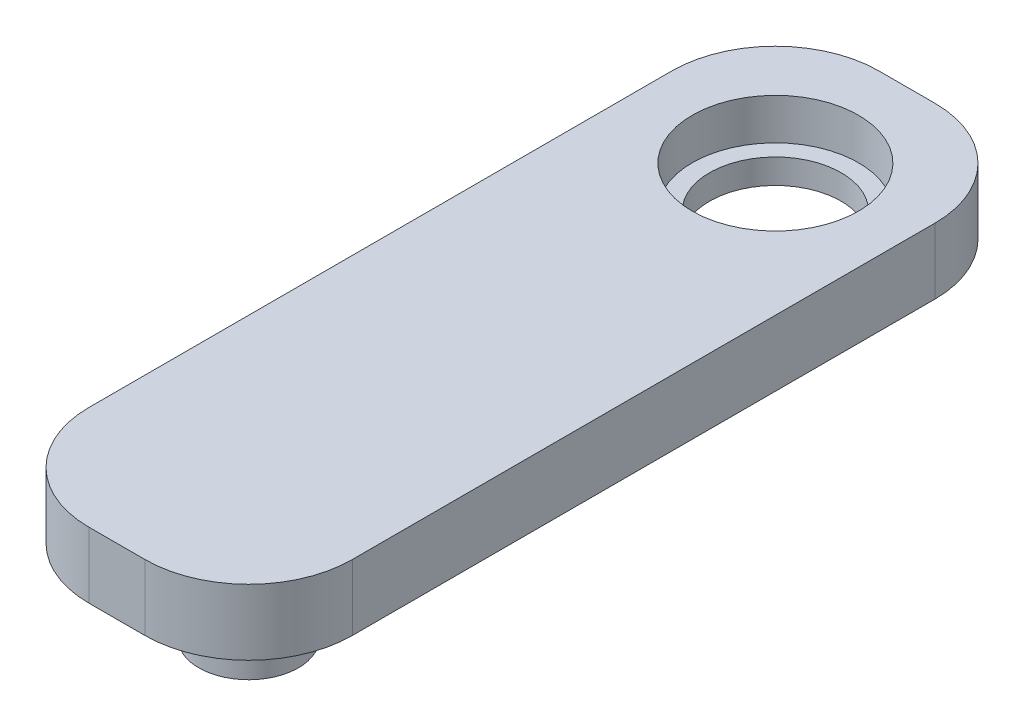
ISO-10303-21;
HEADER;
FILE_DESCRIPTION(('STEP AP214'),'2;1');
FILE_NAME('part.step','',(''),(''),'','','');
FILE_SCHEMA(('AUTOMOTIVE_DESIGN { 1 0 10303 214 1 1 1 1 }'));
ENDSEC;
DATA;
#1=APPLICATION_CONTEXT('core data for automotive mechanical design processes');
#2=APPLICATION_PROTOCOL_DEFINITION('international standard','automotive_design',2000,#1);
#3=PRODUCT_CONTEXT('',#1,'mechanical');
#4=PRODUCT('Part','Part','',(#3));
#5=PRODUCT_RELATED_PRODUCT_CATEGORY('part','',(#4));
#6=PRODUCT_DEFINITION_FORMATION('','',#4);
#7=PRODUCT_DEFINITION_CONTEXT('part definition',#1,'design');
#8=PRODUCT_DEFINITION('design','',#6,#7);
#9=PRODUCT_DEFINITION_SHAPE('','',#8);
#10=(LENGTH_UNIT() NAMED_UNIT(*) SI_UNIT(.MILLI.,.METRE.));
#11=(NAMED_UNIT(*) PLANE_ANGLE_UNIT() SI_UNIT($,.RADIAN.));
#12=(NAMED_UNIT(*) SI_UNIT($,.STERADIAN.) SOLID_ANGLE_UNIT());
#13=UNCERTAINTY_MEASURE_WITH_UNIT(LENGTH_MEASURE(1.E-05),#10,'distance_accuracy_value','');
#14=(GEOMETRIC_REPRESENTATION_CONTEXT(3) GLOBAL_UNCERTAINTY_ASSIGNED_CONTEXT((#13)) GLOBAL_UNIT_ASSIGNED_CONTEXT((#10,
#11,#12)) REPRESENTATION_CONTEXT('',''));
#15=CARTESIAN_POINT('',(0.,0.,0.));
#16=DIRECTION('',(0.,0.,1.));
#17=DIRECTION('',(1.,0.,0.));
#18=AXIS2_PLACEMENT_3D('',#15,#16,#17);
#19=CARTESIAN_POINT('',(0.,6.35,0.));
#20=DIRECTION('',(1.,0.,0.));
#21=DIRECTION('',(0.,0.,-1.));
#22=AXIS2_PLACEMENT_3D('',#19,#20,#21);
#23=PLANE('',#22);
#24=DIRECTION('',(0.,0.,1.));
#25=VECTOR('',#24,1.);
#26=CARTESIAN_POINT('',(0.,0.,0.));
#27=LINE('',#26,#25);
#28=CARTESIAN_POINT('',(0.,0.,-66.2));
#29=VERTEX_POINT('',#28);
#30=CARTESIAN_POINT('',(0.,0.,-9.99999999999999));
#31=VERTEX_POINT('',#30);
#32=EDGE_CURVE('E127',#29,#31,#27,.T.);
#33=ORIENTED_EDGE('',*,*,#32,.T.);
#34=DIRECTION('',(0.,-1.,0.));
#35=VECTOR('',#34,1.);
#36=CARTESIAN_POINT('',(0.,6.35,-10.));
#37=LINE('',#36,#35);
#38=CARTESIAN_POINT('',(0.,6.35,-9.99999999999999));
#39=VERTEX_POINT('',#38);
#40=EDGE_CURVE('E105',#31,#39,#37,.F.);
#41=ORIENTED_EDGE('',*,*,#40,.T.);
#42=DIRECTION('',(0.,0.,1.));
#43=VECTOR('',#42,1.);
#44=CARTESIAN_POINT('',(0.,6.35,0.));
#45=LINE('',#44,#43);
#46=CARTESIAN_POINT('',(0.,6.35,-66.2));
#47=VERTEX_POINT('',#46);
#48=EDGE_CURVE('E137',#47,#39,#45,.T.);
#49=ORIENTED_EDGE('',*,*,#48,.F.);
#50=DIRECTION('',(0.,-1.,0.));
#51=VECTOR('',#50,1.);
#52=CARTESIAN_POINT('',(0.,6.35,-66.2));
#53=LINE('',#52,#51);
#54=EDGE_CURVE('E110',#47,#29,#53,.T.);
#55=ORIENTED_EDGE('',*,*,#54,.T.);
#56=EDGE_LOOP('',(#33,#41,#49,#55));
#57=FACE_BOUND('',#56,.T.);
#58=ADVANCED_FACE('F35',(#57),#23,.F.);
#59=CARTESIAN_POINT('',(0.,6.35,0.));
#60=DIRECTION('',(0.,0.,-1.));
#61=DIRECTION('',(-1.,0.,0.));
#62=AXIS2_PLACEMENT_3D('',#59,#60,#61);
#63=PLANE('',#62);
#64=DIRECTION('',(1.,0.,0.));
#65=VECTOR('',#64,1.);
#66=CARTESIAN_POINT('',(0.,6.35,0.));
#67=LINE('',#66,#65);
#68=CARTESIAN_POINT('',(10.,6.35,0.));
#69=VERTEX_POINT('',#68);
#70=CARTESIAN_POINT('',(15.4,6.35,0.));
#71=VERTEX_POINT('',#70);
#72=EDGE_CURVE('E120',#69,#71,#67,.T.);
#73=ORIENTED_EDGE('',*,*,#72,.F.);
#74=DIRECTION('',(0.,-1.,0.));
#75=VECTOR('',#74,1.);
#76=CARTESIAN_POINT('',(10.,6.35,0.));
#77=LINE('',#76,#75);
#78=CARTESIAN_POINT('',(10.,0.,0.));
#79=VERTEX_POINT('',#78);
#80=EDGE_CURVE('E104',#69,#79,#77,.T.);
#81=ORIENTED_EDGE('',*,*,#80,.T.);
#82=DIRECTION('',(1.,0.,0.));
#83=VECTOR('',#82,1.);
#84=CARTESIAN_POINT('',(0.,0.,0.));
#85=LINE('',#84,#83);
#86=CARTESIAN_POINT('',(15.4,0.,0.));
#87=VERTEX_POINT('',#86);
#88=EDGE_CURVE('E117',#79,#87,#85,.T.);
#89=ORIENTED_EDGE('',*,*,#88,.T.);
#90=DIRECTION('',(0.,-1.,0.));
#91=VECTOR('',#90,1.);
#92=CARTESIAN_POINT('',(15.4,6.35,0.));
#93=LINE('',#92,#91);
#94=EDGE_CURVE('E122',#87,#71,#93,.F.);
#95=ORIENTED_EDGE('',*,*,#94,.T.);
#96=EDGE_LOOP('',(#73,#81,#89,#95));
#97=FACE_BOUND('',#96,.T.);
#98=ADVANCED_FACE('F116',(#97),#63,.F.);
#99=CARTESIAN_POINT('',(25.4,6.35,0.));
#100=DIRECTION('',(-1.,0.,0.));
#101=DIRECTION('',(0.,0.,1.));
#102=AXIS2_PLACEMENT_3D('',#99,#100,#101);
#103=PLANE('',#102);
#104=DIRECTION('',(0.,0.,-1.));
#105=VECTOR('',#104,1.);
#106=CARTESIAN_POINT('',(25.4,6.35,0.));
#107=LINE('',#106,#105);
#108=CARTESIAN_POINT('',(25.4,6.35,-10.));
#109=VERTEX_POINT('',#108);
#110=CARTESIAN_POINT('',(25.4,6.35,-66.2));
#111=VERTEX_POINT('',#110);
#112=EDGE_CURVE('E172',#109,#111,#107,.T.);
#113=ORIENTED_EDGE('',*,*,#112,.F.);
#114=DIRECTION('',(0.,-1.,0.));
#115=VECTOR('',#114,1.);
#116=CARTESIAN_POINT('',(25.4,6.35,-10.));
#117=LINE('',#116,#115);
#118=CARTESIAN_POINT('',(25.4,0.,-10.));
#119=VERTEX_POINT('',#118);
#120=EDGE_CURVE('E156',#109,#119,#117,.T.);
#121=ORIENTED_EDGE('',*,*,#120,.T.);
#122=DIRECTION('',(0.,0.,-1.));
#123=VECTOR('',#122,1.);
#124=CARTESIAN_POINT('',(25.4,0.,0.));
#125=LINE('',#124,#123);
#126=CARTESIAN_POINT('',(25.4,0.,-66.2));
#127=VERTEX_POINT('',#126);
#128=EDGE_CURVE('E126',#119,#127,#125,.T.);
#129=ORIENTED_EDGE('',*,*,#128,.T.);
#130=DIRECTION('',(0.,-1.,0.));
#131=VECTOR('',#130,1.);
#132=CARTESIAN_POINT('',(25.4,6.35,-66.2));
#133=LINE('',#132,#131);
#134=EDGE_CURVE('E154',#127,#111,#133,.F.);
#135=ORIENTED_EDGE('',*,*,#134,.T.);
#136=EDGE_LOOP('',(#113,#121,#129,#135));
#137=FACE_BOUND('',#136,.T.);
#138=ADVANCED_FACE('F213',(#137),#103,.F.);
#139=CARTESIAN_POINT('',(0.,6.35,-76.2));
#140=DIRECTION('',(0.,0.,1.));
#141=DIRECTION('',(1.,0.,0.));
#142=AXIS2_PLACEMENT_3D('',#139,#140,#141);
#143=PLANE('',#142);
#144=DIRECTION('',(-1.,0.,0.));
#145=VECTOR('',#144,1.);
#146=CARTESIAN_POINT('',(0.,0.,-76.2));
#147=LINE('',#146,#145);
#148=CARTESIAN_POINT('',(15.4,0.,-76.2));
#149=VERTEX_POINT('',#148);
#150=CARTESIAN_POINT('',(9.99999999999998,0.,-76.2));
#151=VERTEX_POINT('',#150);
#152=EDGE_CURVE('E130',#149,#151,#147,.T.);
#153=ORIENTED_EDGE('',*,*,#152,.T.);
#154=DIRECTION('',(0.,-1.,0.));
#155=VECTOR('',#154,1.);
#156=CARTESIAN_POINT('',(9.99999999999998,6.35,-76.2));
#157=LINE('',#156,#155);
#158=CARTESIAN_POINT('',(9.99999999999998,6.35,-76.2));
#159=VERTEX_POINT('',#158);
#160=EDGE_CURVE('E11',#151,#159,#157,.F.);
#161=ORIENTED_EDGE('',*,*,#160,.T.);
#162=DIRECTION('',(-1.,0.,0.));
#163=VECTOR('',#162,1.);
#164=CARTESIAN_POINT('',(0.,6.35,-76.2));
#165=LINE('',#164,#163);
#166=CARTESIAN_POINT('',(15.4,6.35,-76.2));
#167=VERTEX_POINT('',#166);
#168=EDGE_CURVE('E162',#167,#159,#165,.T.);
#169=ORIENTED_EDGE('',*,*,#168,.F.);
#170=DIRECTION('',(0.,-1.,0.));
#171=VECTOR('',#170,1.);
#172=CARTESIAN_POINT('',(15.4,6.35,-76.2));
#173=LINE('',#172,#171);
#174=EDGE_CURVE('E43',#167,#149,#173,.T.);
#175=ORIENTED_EDGE('',*,*,#174,.T.);
#176=EDGE_LOOP('',(#153,#161,#169,#175));
#177=FACE_BOUND('',#176,.T.);
#178=ADVANCED_FACE('F161',(#177),#143,.F.);
#179=CARTESIAN_POINT('',(0.,6.35,0.));
#180=DIRECTION('',(0.,-1.,0.));
#181=DIRECTION('',(0.,0.,-1.));
#182=AXIS2_PLACEMENT_3D('',#179,#180,#181);
#183=PLANE('',#182);
#184=CARTESIAN_POINT('',(12.7,6.35,-63.5));
#185=DIRECTION('',(0.,1.,0.));
#186=DIRECTION('',(0.,0.,1.));
#187=AXIS2_PLACEMENT_3D('',#184,#185,#186);
#188=CIRCLE('',#187,8.016875);
#189=CARTESIAN_POINT('',(12.7,6.35,-55.483125));
#190=VERTEX_POINT('',#189);
#191=EDGE_CURVE('E175',#190,#190,#188,.T.);
#192=ORIENTED_EDGE('',*,*,#191,.F.);
#193=EDGE_LOOP('',(#192));
#194=FACE_BOUND('',#193,.T.);
#195=ORIENTED_EDGE('',*,*,#48,.T.);
#196=CARTESIAN_POINT('',(10.,6.35,-10.));
#197=DIRECTION('',(0.,-1.,0.));
#198=DIRECTION('',(0.,0.,-1.));
#199=AXIS2_PLACEMENT_3D('',#196,#197,#198);
#200=CIRCLE('',#199,10.);
#201=EDGE_CURVE('E152',#39,#69,#200,.F.);
#202=ORIENTED_EDGE('',*,*,#201,.T.);
#203=ORIENTED_EDGE('',*,*,#72,.T.);
#204=CARTESIAN_POINT('',(15.4,6.35,-10.));
#205=DIRECTION('',(0.,-1.,0.));
#206=DIRECTION('',(0.,0.,-1.));
#207=AXIS2_PLACEMENT_3D('',#204,#205,#206);
#208=CIRCLE('',#207,10.);
#209=EDGE_CURVE('E150',#71,#109,#208,.F.);
#210=ORIENTED_EDGE('',*,*,#209,.T.);
#211=ORIENTED_EDGE('',*,*,#112,.T.);
#212=CARTESIAN_POINT('',(15.4,6.35,-66.2));
#213=DIRECTION('',(0.,-1.,0.));
#214=DIRECTION('',(0.,0.,-1.));
#215=AXIS2_PLACEMENT_3D('',#212,#213,#214);
#216=CIRCLE('',#215,10.);
#217=EDGE_CURVE('E55',#111,#167,#216,.F.);
#218=ORIENTED_EDGE('',*,*,#217,.T.);
#219=ORIENTED_EDGE('',*,*,#168,.T.);
#220=CARTESIAN_POINT('',(9.99999999999998,6.35,-66.2));
#221=DIRECTION('',(0.,-1.,0.));
#222=DIRECTION('',(0.,0.,-1.));
#223=AXIS2_PLACEMENT_3D('',#220,#221,#222);
#224=CIRCLE('',#223,10.);
#225=EDGE_CURVE('E148',#159,#47,#224,.F.);
#226=ORIENTED_EDGE('',*,*,#225,.T.);
#227=EDGE_LOOP('',(#195,#202,#203,#210,#211,#218,#219,#226));
#228=FACE_BOUND('',#227,.T.);
#229=ADVANCED_FACE('F204',(#194,#228),#183,.F.);
#230=CARTESIAN_POINT('',(0.,0.,0.));
#231=DIRECTION('',(0.,-1.,0.));
#232=DIRECTION('',(0.,0.,-1.));
#233=AXIS2_PLACEMENT_3D('',#230,#231,#232);
#234=PLANE('',#233);
#235=CARTESIAN_POINT('',(12.7,0.,-12.7));
#236=DIRECTION('',(0.,-1.,0.));
#237=DIRECTION('',(0.,0.,-1.));
#238=AXIS2_PLACEMENT_3D('',#235,#236,#237);
#239=CIRCLE('',#238,5.55625);
#240=CARTESIAN_POINT('',(12.7,0.,-18.25625));
#241=VERTEX_POINT('',#240);
#242=EDGE_CURVE('E189',#241,#241,#239,.T.);
#243=ORIENTED_EDGE('',*,*,#242,.F.);
#244=EDGE_LOOP('',(#243));
#245=FACE_BOUND('',#244,.T.);
#246=CARTESIAN_POINT('',(12.7,0.,-63.5));
#247=DIRECTION('',(0.,1.,0.));
#248=DIRECTION('',(0.,0.,1.));
#249=AXIS2_PLACEMENT_3D('',#246,#247,#248);
#250=CIRCLE('',#249,6.35);
#251=CARTESIAN_POINT('',(12.7,0.,-57.15));
#252=VERTEX_POINT('',#251);
#253=EDGE_CURVE('E192',#252,#252,#250,.T.);
#254=ORIENTED_EDGE('',*,*,#253,.T.);
#255=EDGE_LOOP('',(#254));
#256=FACE_BOUND('',#255,.T.);
#257=ORIENTED_EDGE('',*,*,#88,.F.);
#258=CARTESIAN_POINT('',(10.,0.,-10.));
#259=DIRECTION('',(0.,-1.,0.));
#260=DIRECTION('',(0.,0.,-1.));
#261=AXIS2_PLACEMENT_3D('',#258,#259,#260);
#262=CIRCLE('',#261,10.);
#263=EDGE_CURVE('E100',#79,#31,#262,.T.);
#264=ORIENTED_EDGE('',*,*,#263,.T.);
#265=ORIENTED_EDGE('',*,*,#32,.F.);
#266=CARTESIAN_POINT('',(9.99999999999998,0.,-66.2));
#267=DIRECTION('',(0.,-1.,0.));
#268=DIRECTION('',(0.,0.,-1.));
#269=AXIS2_PLACEMENT_3D('',#266,#267,#268);
#270=CIRCLE('',#269,10.);
#271=EDGE_CURVE('E141',#29,#151,#270,.T.);
#272=ORIENTED_EDGE('',*,*,#271,.T.);
#273=ORIENTED_EDGE('',*,*,#152,.F.);
#274=CARTESIAN_POINT('',(15.4,0.,-66.2));
#275=DIRECTION('',(0.,-1.,0.));
#276=DIRECTION('',(0.,0.,-1.));
#277=AXIS2_PLACEMENT_3D('',#274,#275,#276);
#278=CIRCLE('',#277,10.);
#279=EDGE_CURVE('E121',#149,#127,#278,.T.);
#280=ORIENTED_EDGE('',*,*,#279,.T.);
#281=ORIENTED_EDGE('',*,*,#128,.F.);
#282=CARTESIAN_POINT('',(15.4,0.,-10.));
#283=DIRECTION('',(0.,-1.,0.));
#284=DIRECTION('',(0.,0.,-1.));
#285=AXIS2_PLACEMENT_3D('',#282,#283,#284);
#286=CIRCLE('',#285,10.);
#287=EDGE_CURVE('E111',#119,#87,#286,.T.);
#288=ORIENTED_EDGE('',*,*,#287,.T.);
#289=EDGE_LOOP('',(#257,#264,#265,#272,#273,#280,#281,#288));
#290=FACE_BOUND('',#289,.T.);
#291=ADVANCED_FACE('F124',(#245,#256,#290),#234,.T.);
#292=CARTESIAN_POINT('',(12.7,2.38125,-63.5));
#293=DIRECTION('',(0.,1.,0.));
#294=DIRECTION('',(0.,0.,1.));
#295=AXIS2_PLACEMENT_3D('',#292,#293,#294);
#296=CYLINDRICAL_SURFACE('',#295,8.016875);
#297=CARTESIAN_POINT('',(12.7,2.38125,-63.5));
#298=DIRECTION('',(0.,1.,0.));
#299=DIRECTION('',(0.,0.,1.));
#300=AXIS2_PLACEMENT_3D('',#297,#298,#299);
#301=CIRCLE('',#300,8.016875);
#302=CARTESIAN_POINT('',(12.7,2.38125,-55.483125));
#303=VERTEX_POINT('',#302);
#304=EDGE_CURVE('E132',#303,#303,#301,.T.);
#305=ORIENTED_EDGE('',*,*,#304,.F.);
#306=EDGE_LOOP('',(#305));
#307=FACE_BOUND('',#306,.T.);
#308=ORIENTED_EDGE('',*,*,#191,.T.);
#309=EDGE_LOOP('',(#308));
#310=FACE_BOUND('',#309,.T.);
#311=ADVANCED_FACE('F202',(#307,#310),#296,.F.);
#312=CARTESIAN_POINT('',(12.7,2.38125,-63.5));
#313=DIRECTION('',(0.,1.,0.));
#314=DIRECTION('',(0.,0.,1.));
#315=AXIS2_PLACEMENT_3D('',#312,#313,#314);
#316=PLANE('',#315);
#317=CARTESIAN_POINT('',(12.7,2.38125,-63.5));
#318=DIRECTION('',(0.,1.,0.));
#319=DIRECTION('',(0.,0.,1.));
#320=AXIS2_PLACEMENT_3D('',#317,#318,#319);
#321=CIRCLE('',#320,6.35);
#322=CARTESIAN_POINT('',(12.7,2.38125,-57.15));
#323=VERTEX_POINT('',#322);
#324=EDGE_CURVE('E188',#323,#323,#321,.T.);
#325=ORIENTED_EDGE('',*,*,#324,.F.);
#326=EDGE_LOOP('',(#325));
#327=FACE_BOUND('',#326,.T.);
#328=ORIENTED_EDGE('',*,*,#304,.T.);
#329=EDGE_LOOP('',(#328));
#330=FACE_BOUND('',#329,.T.);
#331=ADVANCED_FACE('F322',(#327,#330),#316,.T.);
#332=CARTESIAN_POINT('',(12.7,0.,-63.5));
#333=DIRECTION('',(0.,1.,0.));
#334=DIRECTION('',(0.,0.,1.));
#335=AXIS2_PLACEMENT_3D('',#332,#333,#334);
#336=CYLINDRICAL_SURFACE('',#335,6.35);
#337=ORIENTED_EDGE('',*,*,#253,.F.);
#338=EDGE_LOOP('',(#337));
#339=FACE_BOUND('',#338,.T.);
#340=ORIENTED_EDGE('',*,*,#324,.T.);
#341=EDGE_LOOP('',(#340));
#342=FACE_BOUND('',#341,.T.);
#343=ADVANCED_FACE('F314',(#339,#342),#336,.F.);
#344=CARTESIAN_POINT('',(12.7,-4.,-12.7));
#345=DIRECTION('',(0.,1.,0.));
#346=DIRECTION('',(0.,0.,1.));
#347=AXIS2_PLACEMENT_3D('',#344,#345,#346);
#348=CYLINDRICAL_SURFACE('',#347,5.55625);
#349=CARTESIAN_POINT('',(12.7,-4.,-12.7));
#350=DIRECTION('',(0.,-1.,0.));
#351=DIRECTION('',(0.,0.,-1.));
#352=AXIS2_PLACEMENT_3D('',#349,#350,#351);
#353=CIRCLE('',#352,5.55625);
#354=CARTESIAN_POINT('',(12.7,-4.,-18.25625));
#355=VERTEX_POINT('',#354);
#356=EDGE_CURVE('E185',#355,#355,#353,.T.);
#357=ORIENTED_EDGE('',*,*,#356,.F.);
#358=EDGE_LOOP('',(#357));
#359=FACE_BOUND('',#358,.T.);
#360=ORIENTED_EDGE('',*,*,#242,.T.);
#361=EDGE_LOOP('',(#360));
#362=FACE_BOUND('',#361,.T.);
#363=ADVANCED_FACE('F306',(#359,#362),#348,.T.);
#364=CARTESIAN_POINT('',(12.7,-4.,-12.7));
#365=DIRECTION('',(0.,-1.,0.));
#366=DIRECTION('',(0.,0.,-1.));
#367=AXIS2_PLACEMENT_3D('',#364,#365,#366);
#368=PLANE('',#367);
#369=CARTESIAN_POINT('',(12.7,-4.,-12.7));
#370=DIRECTION('',(0.,-1.,0.));
#371=DIRECTION('',(0.,0.,-1.));
#372=AXIS2_PLACEMENT_3D('',#369,#370,#371);
#373=CIRCLE('',#372,4.805);
#374=CARTESIAN_POINT('',(12.7,-4.,-17.505));
#375=VERTEX_POINT('',#374);
#376=EDGE_CURVE('E138',#375,#375,#373,.T.);
#377=ORIENTED_EDGE('',*,*,#376,.F.);
#378=EDGE_LOOP('',(#377));
#379=FACE_BOUND('',#378,.T.);
#380=ORIENTED_EDGE('',*,*,#356,.T.);
#381=EDGE_LOOP('',(#380));
#382=FACE_BOUND('',#381,.T.);
#383=ADVANCED_FACE('F298',(#379,#382),#368,.T.);
#384=CARTESIAN_POINT('',(12.7,-8.,-12.7));
#385=DIRECTION('',(0.,1.,0.));
#386=DIRECTION('',(0.,0.,1.));
#387=AXIS2_PLACEMENT_3D('',#384,#385,#386);
#388=CYLINDRICAL_SURFACE('',#387,4.805);
#389=CARTESIAN_POINT('',(12.7,-8.,-12.7));
#390=DIRECTION('',(0.,-1.,0.));
#391=DIRECTION('',(0.,0.,-1.));
#392=AXIS2_PLACEMENT_3D('',#389,#390,#391);
#393=CIRCLE('',#392,4.805);
#394=CARTESIAN_POINT('',(12.7,-8.,-17.505));
#395=VERTEX_POINT('',#394);
#396=EDGE_CURVE('E184',#395,#395,#393,.T.);
#397=ORIENTED_EDGE('',*,*,#396,.F.);
#398=EDGE_LOOP('',(#397));
#399=FACE_BOUND('',#398,.T.);
#400=ORIENTED_EDGE('',*,*,#376,.T.);
#401=EDGE_LOOP('',(#400));
#402=FACE_BOUND('',#401,.T.);
#403=ADVANCED_FACE('F291',(#399,#402),#388,.T.);
#404=CARTESIAN_POINT('',(12.7,-8.,-12.7));
#405=DIRECTION('',(0.,-1.,0.));
#406=DIRECTION('',(0.,0.,-1.));
#407=AXIS2_PLACEMENT_3D('',#404,#405,#406);
#408=PLANE('',#407);
#409=ORIENTED_EDGE('',*,*,#396,.T.);
#410=EDGE_LOOP('',(#409));
#411=FACE_BOUND('',#410,.T.);
#412=ADVANCED_FACE('F227',(#411),#408,.T.);
#413=CARTESIAN_POINT('',(10.,6.35,-10.));
#414=DIRECTION('',(0.,-1.,0.));
#415=DIRECTION('',(0.,0.,-1.));
#416=AXIS2_PLACEMENT_3D('',#413,#414,#415);
#417=CYLINDRICAL_SURFACE('',#416,10.);
#418=ORIENTED_EDGE('',*,*,#201,.F.);
#419=ORIENTED_EDGE('',*,*,#40,.F.);
#420=ORIENTED_EDGE('',*,*,#263,.F.);
#421=ORIENTED_EDGE('',*,*,#80,.F.);
#422=EDGE_LOOP('',(#418,#419,#420,#421));
#423=FACE_BOUND('',#422,.T.);
#424=ADVANCED_FACE('F103',(#423),#417,.T.);
#425=CARTESIAN_POINT('',(15.4,6.35,-10.));
#426=DIRECTION('',(0.,-1.,0.));
#427=DIRECTION('',(0.,0.,-1.));
#428=AXIS2_PLACEMENT_3D('',#425,#426,#427);
#429=CYLINDRICAL_SURFACE('',#428,10.);
#430=ORIENTED_EDGE('',*,*,#209,.F.);
#431=ORIENTED_EDGE('',*,*,#94,.F.);
#432=ORIENTED_EDGE('',*,*,#287,.F.);
#433=ORIENTED_EDGE('',*,*,#120,.F.);
#434=EDGE_LOOP('',(#430,#431,#432,#433));
#435=FACE_BOUND('',#434,.T.);
#436=ADVANCED_FACE('F226',(#435),#429,.T.);
#437=CARTESIAN_POINT('',(9.99999999999998,6.35,-66.2));
#438=DIRECTION('',(0.,-1.,0.));
#439=DIRECTION('',(0.,0.,-1.));
#440=AXIS2_PLACEMENT_3D('',#437,#438,#439);
#441=CYLINDRICAL_SURFACE('',#440,10.);
#442=ORIENTED_EDGE('',*,*,#225,.F.);
#443=ORIENTED_EDGE('',*,*,#160,.F.);
#444=ORIENTED_EDGE('',*,*,#271,.F.);
#445=ORIENTED_EDGE('',*,*,#54,.F.);
#446=EDGE_LOOP('',(#442,#443,#444,#445));
#447=FACE_BOUND('',#446,.T.);
#448=ADVANCED_FACE('F167',(#447),#441,.T.);
#449=CARTESIAN_POINT('',(15.4,6.35,-66.2));
#450=DIRECTION('',(0.,-1.,0.));
#451=DIRECTION('',(0.,0.,-1.));
#452=AXIS2_PLACEMENT_3D('',#449,#450,#451);
#453=CYLINDRICAL_SURFACE('',#452,10.);
#454=ORIENTED_EDGE('',*,*,#217,.F.);
#455=ORIENTED_EDGE('',*,*,#134,.F.);
#456=ORIENTED_EDGE('',*,*,#279,.F.);
#457=ORIENTED_EDGE('',*,*,#174,.F.);
#458=EDGE_LOOP('',(#454,#455,#456,#457));
#459=FACE_BOUND('',#458,.T.);
#460=ADVANCED_FACE('F37',(#459),#453,.T.);
#461=CLOSED_SHELL('',(#58,#98,#138,#178,#229,#291,#311,#331,#343,#363,#383,#403,#412,#424,#436,
#448,#460));
#462=MANIFOLD_SOLID_BREP('B2',#461);
#463=ADVANCED_BREP_SHAPE_REPRESENTATION('',(#18,#462),#14);
#464=SHAPE_DEFINITION_REPRESENTATION(#9,#463);
ENDSEC;
END-ISO-10303-21;
